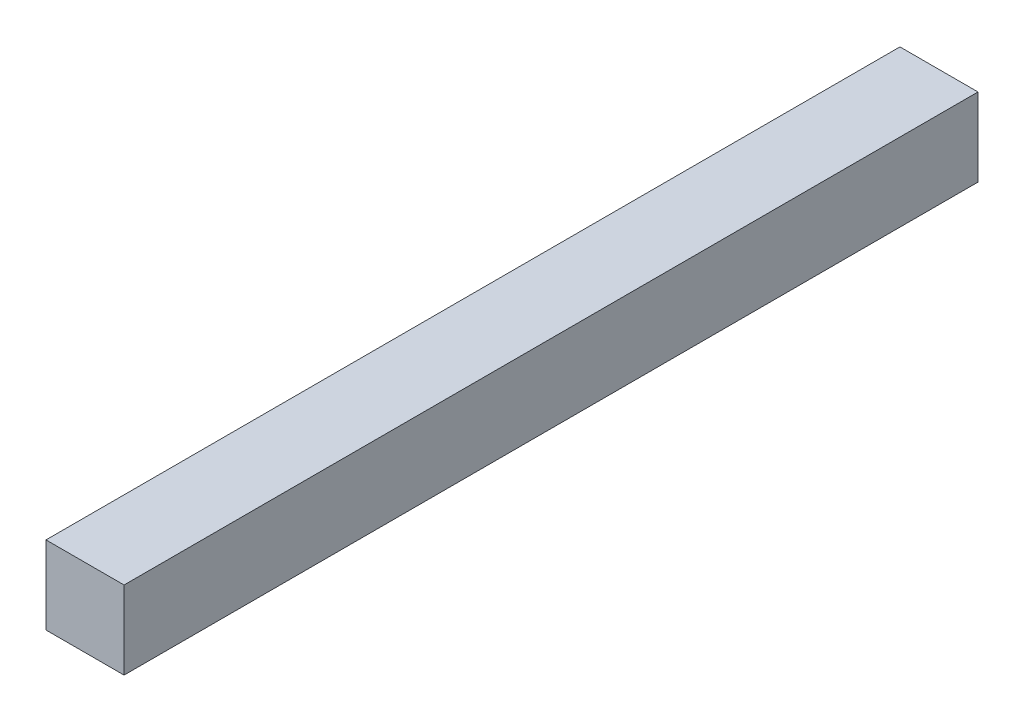
ISO-10303-21;
HEADER;
FILE_DESCRIPTION(('STEP AP214'),'2;1');
FILE_NAME('part.step','',(''),(''),'','','');
FILE_SCHEMA(('AUTOMOTIVE_DESIGN { 1 0 10303 214 1 1 1 1 }'));
ENDSEC;
DATA;
#1=APPLICATION_CONTEXT('core data for automotive mechanical design processes');
#2=APPLICATION_PROTOCOL_DEFINITION('international standard','automotive_design',2000,#1);
#3=PRODUCT_CONTEXT('',#1,'mechanical');
#4=PRODUCT('Part','Part','',(#3));
#5=PRODUCT_RELATED_PRODUCT_CATEGORY('part','',(#4));
#6=PRODUCT_DEFINITION_FORMATION('','',#4);
#7=PRODUCT_DEFINITION_CONTEXT('part definition',#1,'design');
#8=PRODUCT_DEFINITION('design','',#6,#7);
#9=PRODUCT_DEFINITION_SHAPE('','',#8);
#10=(LENGTH_UNIT() NAMED_UNIT(*) SI_UNIT(.MILLI.,.METRE.));
#11=(NAMED_UNIT(*) PLANE_ANGLE_UNIT() SI_UNIT($,.RADIAN.));
#12=(NAMED_UNIT(*) SI_UNIT($,.STERADIAN.) SOLID_ANGLE_UNIT());
#13=UNCERTAINTY_MEASURE_WITH_UNIT(LENGTH_MEASURE(1.E-05),#10,'distance_accuracy_value','');
#14=(GEOMETRIC_REPRESENTATION_CONTEXT(3) GLOBAL_UNCERTAINTY_ASSIGNED_CONTEXT((#13)) GLOBAL_UNIT_ASSIGNED_CONTEXT((#10,
#11,#12)) REPRESENTATION_CONTEXT('',''));
#15=CARTESIAN_POINT('',(0.,0.,0.));
#16=DIRECTION('',(0.,0.,1.));
#17=DIRECTION('',(1.,0.,0.));
#18=AXIS2_PLACEMENT_3D('',#15,#16,#17);
#19=CARTESIAN_POINT('',(1.6,-1.6,35.));
#20=DIRECTION('',(-1.,0.,0.));
#21=DIRECTION('',(0.,0.,1.));
#22=AXIS2_PLACEMENT_3D('',#19,#20,#21);
#23=PLANE('',#22);
#24=DIRECTION('',(0.,1.,0.));
#25=VECTOR('',#24,1.);
#26=CARTESIAN_POINT('',(1.6,-1.6,0.));
#27=LINE('',#26,#25);
#28=CARTESIAN_POINT('',(1.6,-1.6,0.));
#29=VERTEX_POINT('',#28);
#30=CARTESIAN_POINT('',(1.6,1.6,0.));
#31=VERTEX_POINT('',#30);
#32=EDGE_CURVE('E96',#29,#31,#27,.T.);
#33=ORIENTED_EDGE('',*,*,#32,.T.);
#34=DIRECTION('',(0.,0.,-1.));
#35=VECTOR('',#34,1.);
#36=CARTESIAN_POINT('',(1.6,1.6,35.));
#37=LINE('',#36,#35);
#38=CARTESIAN_POINT('',(1.6,1.6,35.));
#39=VERTEX_POINT('',#38);
#40=EDGE_CURVE('E11',#39,#31,#37,.T.);
#41=ORIENTED_EDGE('',*,*,#40,.F.);
#42=DIRECTION('',(0.,1.,0.));
#43=VECTOR('',#42,1.);
#44=CARTESIAN_POINT('',(1.6,-1.6,35.));
#45=LINE('',#44,#43);
#46=CARTESIAN_POINT('',(1.6,-1.6,35.));
#47=VERTEX_POINT('',#46);
#48=EDGE_CURVE('E84',#47,#39,#45,.T.);
#49=ORIENTED_EDGE('',*,*,#48,.F.);
#50=DIRECTION('',(0.,0.,-1.));
#51=VECTOR('',#50,1.);
#52=CARTESIAN_POINT('',(1.6,-1.6,35.));
#53=LINE('',#52,#51);
#54=EDGE_CURVE('E92',#47,#29,#53,.T.);
#55=ORIENTED_EDGE('',*,*,#54,.T.);
#56=EDGE_LOOP('',(#33,#41,#49,#55));
#57=FACE_BOUND('',#56,.T.);
#58=ADVANCED_FACE('F33',(#57),#23,.F.);
#59=CARTESIAN_POINT('',(-1.6,1.6,35.));
#60=DIRECTION('',(0.,-1.,0.));
#61=DIRECTION('',(0.,0.,-1.));
#62=AXIS2_PLACEMENT_3D('',#59,#60,#61);
#63=PLANE('',#62);
#64=DIRECTION('',(-1.,0.,0.));
#65=VECTOR('',#64,1.);
#66=CARTESIAN_POINT('',(-1.6,1.6,0.));
#67=LINE('',#66,#65);
#68=CARTESIAN_POINT('',(-1.6,1.6,0.));
#69=VERTEX_POINT('',#68);
#70=EDGE_CURVE('E88',#31,#69,#67,.T.);
#71=ORIENTED_EDGE('',*,*,#70,.T.);
#72=DIRECTION('',(0.,0.,-1.));
#73=VECTOR('',#72,1.);
#74=CARTESIAN_POINT('',(-1.6,1.6,35.));
#75=LINE('',#74,#73);
#76=CARTESIAN_POINT('',(-1.6,1.6,35.));
#77=VERTEX_POINT('',#76);
#78=EDGE_CURVE('E41',#77,#69,#75,.T.);
#79=ORIENTED_EDGE('',*,*,#78,.F.);
#80=DIRECTION('',(-1.,0.,0.));
#81=VECTOR('',#80,1.);
#82=CARTESIAN_POINT('',(-1.6,1.6,35.));
#83=LINE('',#82,#81);
#84=EDGE_CURVE('E79',#39,#77,#83,.T.);
#85=ORIENTED_EDGE('',*,*,#84,.F.);
#86=ORIENTED_EDGE('',*,*,#40,.T.);
#87=EDGE_LOOP('',(#71,#79,#85,#86));
#88=FACE_BOUND('',#87,.T.);
#89=ADVANCED_FACE('F87',(#88),#63,.F.);
#90=CARTESIAN_POINT('',(-1.6,-1.6,35.));
#91=DIRECTION('',(1.,0.,0.));
#92=DIRECTION('',(0.,0.,-1.));
#93=AXIS2_PLACEMENT_3D('',#90,#91,#92);
#94=PLANE('',#93);
#95=DIRECTION('',(0.,-1.,0.));
#96=VECTOR('',#95,1.);
#97=CARTESIAN_POINT('',(-1.6,-1.6,0.));
#98=LINE('',#97,#96);
#99=CARTESIAN_POINT('',(-1.6,-1.6,0.));
#100=VERTEX_POINT('',#99);
#101=EDGE_CURVE('E66',#69,#100,#98,.T.);
#102=ORIENTED_EDGE('',*,*,#101,.T.);
#103=DIRECTION('',(0.,0.,-1.));
#104=VECTOR('',#103,1.);
#105=CARTESIAN_POINT('',(-1.6,-1.6,35.));
#106=LINE('',#105,#104);
#107=CARTESIAN_POINT('',(-1.6,-1.6,35.));
#108=VERTEX_POINT('',#107);
#109=EDGE_CURVE('E89',#108,#100,#106,.T.);
#110=ORIENTED_EDGE('',*,*,#109,.F.);
#111=DIRECTION('',(0.,-1.,0.));
#112=VECTOR('',#111,1.);
#113=CARTESIAN_POINT('',(-1.6,-1.6,35.));
#114=LINE('',#113,#112);
#115=EDGE_CURVE('E82',#77,#108,#114,.T.);
#116=ORIENTED_EDGE('',*,*,#115,.F.);
#117=ORIENTED_EDGE('',*,*,#78,.T.);
#118=EDGE_LOOP('',(#102,#110,#116,#117));
#119=FACE_BOUND('',#118,.T.);
#120=ADVANCED_FACE('F90',(#119),#94,.F.);
#121=CARTESIAN_POINT('',(-1.6,-1.6,35.));
#122=DIRECTION('',(0.,1.,0.));
#123=DIRECTION('',(0.,0.,1.));
#124=AXIS2_PLACEMENT_3D('',#121,#122,#123);
#125=PLANE('',#124);
#126=DIRECTION('',(1.,0.,0.));
#127=VECTOR('',#126,1.);
#128=CARTESIAN_POINT('',(-1.6,-1.6,0.));
#129=LINE('',#128,#127);
#130=EDGE_CURVE('E72',#100,#29,#129,.T.);
#131=ORIENTED_EDGE('',*,*,#130,.T.);
#132=ORIENTED_EDGE('',*,*,#54,.F.);
#133=DIRECTION('',(1.,0.,0.));
#134=VECTOR('',#133,1.);
#135=CARTESIAN_POINT('',(-1.6,-1.6,35.));
#136=LINE('',#135,#134);
#137=EDGE_CURVE('E49',#108,#47,#136,.T.);
#138=ORIENTED_EDGE('',*,*,#137,.F.);
#139=ORIENTED_EDGE('',*,*,#109,.T.);
#140=EDGE_LOOP('',(#131,#132,#138,#139));
#141=FACE_BOUND('',#140,.T.);
#142=ADVANCED_FACE('F103',(#141),#125,.F.);
#143=CARTESIAN_POINT('',(0.,0.,35.));
#144=DIRECTION('',(0.,0.,-1.));
#145=DIRECTION('',(-1.,0.,0.));
#146=AXIS2_PLACEMENT_3D('',#143,#144,#145);
#147=PLANE('',#146);
#148=ORIENTED_EDGE('',*,*,#48,.T.);
#149=ORIENTED_EDGE('',*,*,#84,.T.);
#150=ORIENTED_EDGE('',*,*,#115,.T.);
#151=ORIENTED_EDGE('',*,*,#137,.T.);
#152=EDGE_LOOP('',(#148,#149,#150,#151));
#153=FACE_BOUND('',#152,.T.);
#154=ADVANCED_FACE('F80',(#153),#147,.F.);
#155=CARTESIAN_POINT('',(0.,0.,0.));
#156=DIRECTION('',(0.,0.,-1.));
#157=DIRECTION('',(-1.,0.,0.));
#158=AXIS2_PLACEMENT_3D('',#155,#156,#157);
#159=PLANE('',#158);
#160=ORIENTED_EDGE('',*,*,#32,.F.);
#161=ORIENTED_EDGE('',*,*,#130,.F.);
#162=ORIENTED_EDGE('',*,*,#101,.F.);
#163=ORIENTED_EDGE('',*,*,#70,.F.);
#164=EDGE_LOOP('',(#160,#161,#162,#163));
#165=FACE_BOUND('',#164,.T.);
#166=ADVANCED_FACE('F106',(#165),#159,.T.);
#167=CLOSED_SHELL('',(#58,#89,#120,#142,#154,#166));
#168=MANIFOLD_SOLID_BREP('B2',#167);
#169=ADVANCED_BREP_SHAPE_REPRESENTATION('',(#18,#168),#14);
#170=SHAPE_DEFINITION_REPRESENTATION(#9,#169);
ENDSEC;
END-ISO-10303-21;
